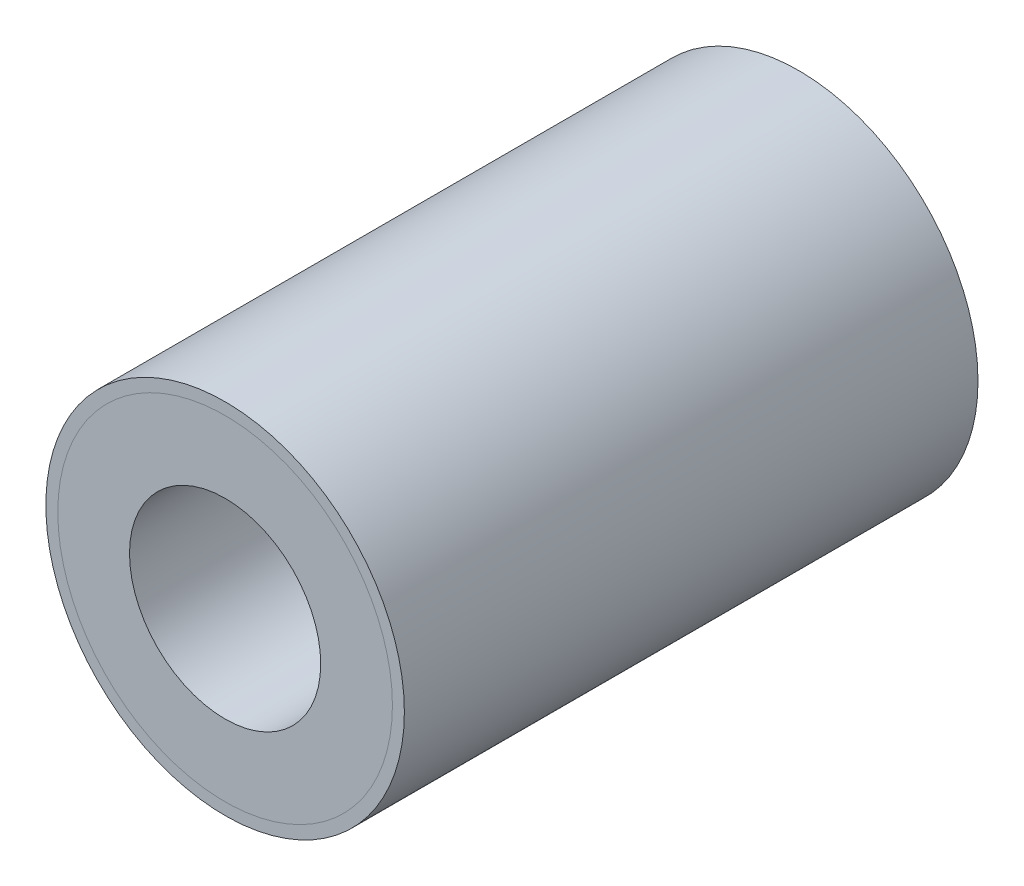
ISO-10303-21;
HEADER;
FILE_DESCRIPTION(('STEP AP214'),'2;1');
FILE_NAME('part.step','',(''),(''),'','','');
FILE_SCHEMA(('AUTOMOTIVE_DESIGN { 1 0 10303 214 1 1 1 1 }'));
ENDSEC;
DATA;
#1=APPLICATION_CONTEXT('core data for automotive mechanical design processes');
#2=APPLICATION_PROTOCOL_DEFINITION('international standard','automotive_design',2000,#1);
#3=PRODUCT_CONTEXT('',#1,'mechanical');
#4=PRODUCT('Part','Part','',(#3));
#5=PRODUCT_RELATED_PRODUCT_CATEGORY('part','',(#4));
#6=PRODUCT_DEFINITION_FORMATION('','',#4);
#7=PRODUCT_DEFINITION_CONTEXT('part definition',#1,'design');
#8=PRODUCT_DEFINITION('design','',#6,#7);
#9=PRODUCT_DEFINITION_SHAPE('','',#8);
#10=(LENGTH_UNIT() NAMED_UNIT(*) SI_UNIT(.MILLI.,.METRE.));
#11=(NAMED_UNIT(*) PLANE_ANGLE_UNIT() SI_UNIT($,.RADIAN.));
#12=(NAMED_UNIT(*) SI_UNIT($,.STERADIAN.) SOLID_ANGLE_UNIT());
#13=UNCERTAINTY_MEASURE_WITH_UNIT(LENGTH_MEASURE(1.E-05),#10,'distance_accuracy_value','');
#14=(GEOMETRIC_REPRESENTATION_CONTEXT(3) GLOBAL_UNCERTAINTY_ASSIGNED_CONTEXT((#13)) GLOBAL_UNIT_ASSIGNED_CONTEXT((#10,
#11,#12)) REPRESENTATION_CONTEXT('',''));
#15=CARTESIAN_POINT('',(0.,0.,0.));
#16=DIRECTION('',(0.,0.,1.));
#17=DIRECTION('',(1.,0.,0.));
#18=AXIS2_PLACEMENT_3D('',#15,#16,#17);
#19=CARTESIAN_POINT('',(5.55111512312578E-13,0.,24.));
#20=DIRECTION('',(0.,0.,-1.));
#21=DIRECTION('',(-1.00000000000001,0.,0.));
#22=AXIS2_PLACEMENT_3D('',#19,#20,#21);
#23=CYLINDRICAL_SURFACE('',#22,7.);
#24=CARTESIAN_POINT('',(5.55111512312578E-13,0.,24.));
#25=DIRECTION('',(0.,0.,1.));
#26=DIRECTION('',(1.00000000000001,0.,0.));
#27=AXIS2_PLACEMENT_3D('',#24,#25,#26);
#28=CIRCLE('',#27,7.);
#29=CARTESIAN_POINT('',(7.0000000000006,0.,24.));
#30=VERTEX_POINT('',#29);
#31=EDGE_CURVE('E59',#30,#30,#28,.T.);
#32=ORIENTED_EDGE('',*,*,#31,.T.);
#33=EDGE_LOOP('',(#32));
#34=FACE_BOUND('',#33,.T.);
#35=CARTESIAN_POINT('',(0.,0.,0.));
#36=DIRECTION('',(0.,0.,1.));
#37=DIRECTION('',(1.00000000000001,0.,0.));
#38=AXIS2_PLACEMENT_3D('',#35,#36,#37);
#39=CIRCLE('',#38,7.);
#40=CARTESIAN_POINT('',(7.00000000000004,0.,0.));
#41=VERTEX_POINT('',#40);
#42=EDGE_CURVE('E67',#41,#41,#39,.T.);
#43=ORIENTED_EDGE('',*,*,#42,.F.);
#44=EDGE_LOOP('',(#43));
#45=FACE_BOUND('',#44,.T.);
#46=ADVANCED_FACE('F51',(#34,#45),#23,.F.);
#47=CARTESIAN_POINT('',(5.55111512312578E-13,0.,24.));
#48=DIRECTION('',(0.,0.,-1.));
#49=DIRECTION('',(-1.00000000000001,0.,0.));
#50=AXIS2_PLACEMENT_3D('',#47,#48,#49);
#51=CYLINDRICAL_SURFACE('',#50,7.5);
#52=CARTESIAN_POINT('',(5.55111512312578E-13,0.,24.));
#53=DIRECTION('',(0.,0.,1.));
#54=DIRECTION('',(1.00000000000001,0.,0.));
#55=AXIS2_PLACEMENT_3D('',#52,#53,#54);
#56=CIRCLE('',#55,7.5);
#57=CARTESIAN_POINT('',(7.5000000000006,0.,24.));
#58=VERTEX_POINT('',#57);
#59=EDGE_CURVE('E11',#58,#58,#56,.T.);
#60=ORIENTED_EDGE('',*,*,#59,.F.);
#61=EDGE_LOOP('',(#60));
#62=FACE_BOUND('',#61,.T.);
#63=CARTESIAN_POINT('',(0.,0.,0.));
#64=DIRECTION('',(0.,0.,1.));
#65=DIRECTION('',(1.00000000000001,0.,0.));
#66=AXIS2_PLACEMENT_3D('',#63,#64,#65);
#67=CIRCLE('',#66,7.5);
#68=CARTESIAN_POINT('',(7.50000000000004,0.,0.));
#69=VERTEX_POINT('',#68);
#70=EDGE_CURVE('E54',#69,#69,#67,.T.);
#71=ORIENTED_EDGE('',*,*,#70,.T.);
#72=EDGE_LOOP('',(#71));
#73=FACE_BOUND('',#72,.T.);
#74=ADVANCED_FACE('F78',(#62,#73),#51,.T.);
#75=CARTESIAN_POINT('',(5.55111512312578E-13,0.,24.));
#76=DIRECTION('',(0.,0.,1.));
#77=DIRECTION('',(1.00000000000001,0.,0.));
#78=AXIS2_PLACEMENT_3D('',#75,#76,#77);
#79=PLANE('',#78);
#80=ORIENTED_EDGE('',*,*,#31,.F.);
#81=EDGE_LOOP('',(#80));
#82=FACE_BOUND('',#81,.T.);
#83=ORIENTED_EDGE('',*,*,#59,.T.);
#84=EDGE_LOOP('',(#83));
#85=FACE_BOUND('',#84,.T.);
#86=ADVANCED_FACE('F82',(#82,#85),#79,.T.);
#87=CARTESIAN_POINT('',(0.,0.,0.));
#88=DIRECTION('',(0.,0.,1.));
#89=DIRECTION('',(1.00000000000001,0.,0.));
#90=AXIS2_PLACEMENT_3D('',#87,#88,#89);
#91=PLANE('',#90);
#92=ORIENTED_EDGE('',*,*,#42,.T.);
#93=EDGE_LOOP('',(#92));
#94=FACE_BOUND('',#93,.T.);
#95=ORIENTED_EDGE('',*,*,#70,.F.);
#96=EDGE_LOOP('',(#95));
#97=FACE_BOUND('',#96,.T.);
#98=ADVANCED_FACE('F80',(#94,#97),#91,.F.);
#99=CLOSED_SHELL('',(#46,#74,#86,#98));
#100=MANIFOLD_SOLID_BREP('B2',#99);
#101=CARTESIAN_POINT('',(6.10622663543836E-13,1.11022302462516E-13,24.));
#102=DIRECTION('',(0.,0.,-1.));
#103=DIRECTION('',(-1.00000000000001,0.,0.));
#104=AXIS2_PLACEMENT_3D('',#101,#102,#103);
#105=CYLINDRICAL_SURFACE('',#104,4.);
#106=CARTESIAN_POINT('',(6.10622663543836E-13,1.11022302462516E-13,24.));
#107=DIRECTION('',(0.,0.,1.));
#108=DIRECTION('',(1.00000000000001,0.,0.));
#109=AXIS2_PLACEMENT_3D('',#106,#107,#108);
#110=CIRCLE('',#109,4.);
#111=CARTESIAN_POINT('',(4.00000000000064,1.07469588783715E-13,24.));
#112=VERTEX_POINT('',#111);
#113=EDGE_CURVE('E129',#112,#112,#110,.T.);
#114=ORIENTED_EDGE('',*,*,#113,.T.);
#115=EDGE_LOOP('',(#114));
#116=FACE_BOUND('',#115,.T.);
#117=CARTESIAN_POINT('',(0.,0.,0.));
#118=DIRECTION('',(0.,0.,1.));
#119=DIRECTION('',(1.00000000000001,0.,0.));
#120=AXIS2_PLACEMENT_3D('',#117,#118,#119);
#121=CIRCLE('',#120,4.);
#122=CARTESIAN_POINT('',(4.00000000000002,0.,0.));
#123=VERTEX_POINT('',#122);
#124=EDGE_CURVE('E137',#123,#123,#121,.T.);
#125=ORIENTED_EDGE('',*,*,#124,.F.);
#126=EDGE_LOOP('',(#125));
#127=FACE_BOUND('',#126,.T.);
#128=ADVANCED_FACE('F121',(#116,#127),#105,.F.);
#129=CARTESIAN_POINT('',(6.10622663543836E-13,1.11022302462516E-13,24.));
#130=DIRECTION('',(0.,0.,-1.));
#131=DIRECTION('',(-1.00000000000001,0.,0.));
#132=AXIS2_PLACEMENT_3D('',#129,#130,#131);
#133=CYLINDRICAL_SURFACE('',#132,7.);
#134=CARTESIAN_POINT('',(6.10622663543836E-13,1.11022302462516E-13,24.));
#135=DIRECTION('',(0.,0.,1.));
#136=DIRECTION('',(1.00000000000001,0.,0.));
#137=AXIS2_PLACEMENT_3D('',#134,#135,#136);
#138=CIRCLE('',#137,7.);
#139=CARTESIAN_POINT('',(7.00000000000065,1.04805053524615E-13,24.));
#140=VERTEX_POINT('',#139);
#141=EDGE_CURVE('E50',#140,#140,#138,.T.);
#142=ORIENTED_EDGE('',*,*,#141,.F.);
#143=EDGE_LOOP('',(#142));
#144=FACE_BOUND('',#143,.T.);
#145=CARTESIAN_POINT('',(0.,0.,0.));
#146=DIRECTION('',(0.,0.,1.));
#147=DIRECTION('',(1.00000000000001,0.,0.));
#148=AXIS2_PLACEMENT_3D('',#145,#146,#147);
#149=CIRCLE('',#148,7.);
#150=CARTESIAN_POINT('',(7.00000000000004,0.,0.));
#151=VERTEX_POINT('',#150);
#152=EDGE_CURVE('E124',#151,#151,#149,.T.);
#153=ORIENTED_EDGE('',*,*,#152,.T.);
#154=EDGE_LOOP('',(#153));
#155=FACE_BOUND('',#154,.T.);
#156=ADVANCED_FACE('F148',(#144,#155),#133,.T.);
#157=CARTESIAN_POINT('',(6.10622663543836E-13,1.11022302462516E-13,24.));
#158=DIRECTION('',(0.,0.,1.));
#159=DIRECTION('',(1.00000000000001,0.,0.));
#160=AXIS2_PLACEMENT_3D('',#157,#158,#159);
#161=PLANE('',#160);
#162=ORIENTED_EDGE('',*,*,#113,.F.);
#163=EDGE_LOOP('',(#162));
#164=FACE_BOUND('',#163,.T.);
#165=ORIENTED_EDGE('',*,*,#141,.T.);
#166=EDGE_LOOP('',(#165));
#167=FACE_BOUND('',#166,.T.);
#168=ADVANCED_FACE('F152',(#164,#167),#161,.T.);
#169=CARTESIAN_POINT('',(0.,0.,0.));
#170=DIRECTION('',(0.,0.,1.));
#171=DIRECTION('',(1.00000000000001,0.,0.));
#172=AXIS2_PLACEMENT_3D('',#169,#170,#171);
#173=PLANE('',#172);
#174=ORIENTED_EDGE('',*,*,#124,.T.);
#175=EDGE_LOOP('',(#174));
#176=FACE_BOUND('',#175,.T.);
#177=ORIENTED_EDGE('',*,*,#152,.F.);
#178=EDGE_LOOP('',(#177));
#179=FACE_BOUND('',#178,.T.);
#180=ADVANCED_FACE('F150',(#176,#179),#173,.F.);
#181=CLOSED_SHELL('',(#128,#156,#168,#180));
#182=MANIFOLD_SOLID_BREP('B6',#181);
#183=ADVANCED_BREP_SHAPE_REPRESENTATION('',(#18,#100,#182),#14);
#184=SHAPE_DEFINITION_REPRESENTATION(#9,#183);
ENDSEC;
END-ISO-10303-21;
